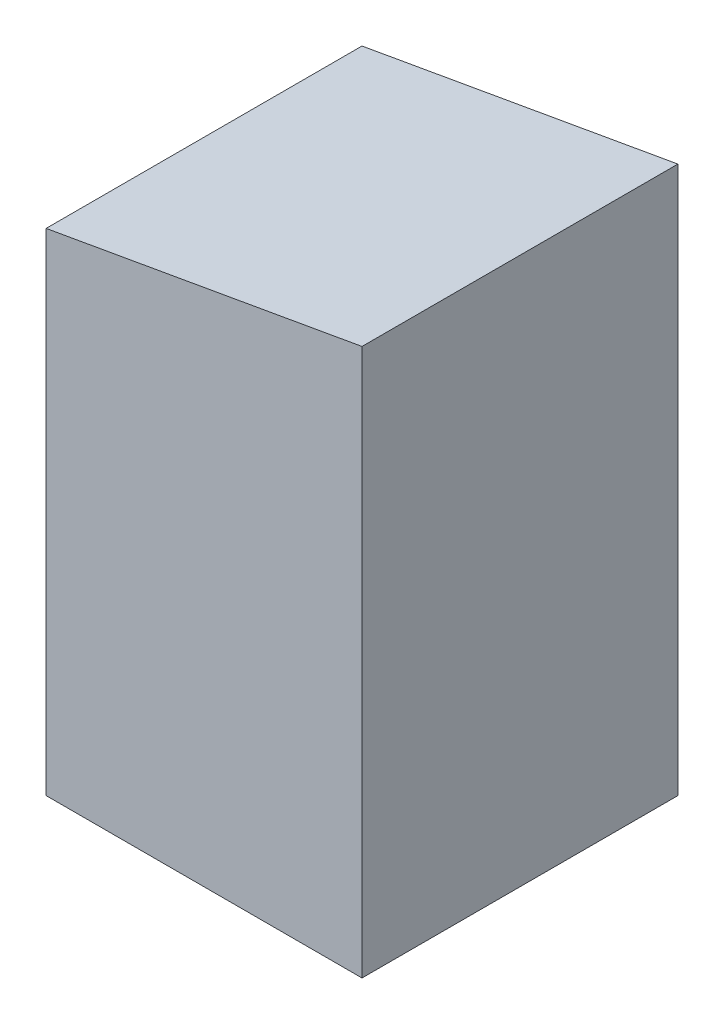
ISO-10303-21;
HEADER;
FILE_DESCRIPTION(('STEP AP214'),'2;1');
FILE_NAME('part.step','',(''),(''),'','','');
FILE_SCHEMA(('AUTOMOTIVE_DESIGN { 1 0 10303 214 1 1 1 1 }'));
ENDSEC;
DATA;
#1=APPLICATION_CONTEXT('core data for automotive mechanical design processes');
#2=APPLICATION_PROTOCOL_DEFINITION('international standard','automotive_design',2000,#1);
#3=PRODUCT_CONTEXT('',#1,'mechanical');
#4=PRODUCT('Part','Part','',(#3));
#5=PRODUCT_RELATED_PRODUCT_CATEGORY('part','',(#4));
#6=PRODUCT_DEFINITION_FORMATION('','',#4);
#7=PRODUCT_DEFINITION_CONTEXT('part definition',#1,'design');
#8=PRODUCT_DEFINITION('design','',#6,#7);
#9=PRODUCT_DEFINITION_SHAPE('','',#8);
#10=(LENGTH_UNIT() NAMED_UNIT(*) SI_UNIT(.MILLI.,.METRE.));
#11=(NAMED_UNIT(*) PLANE_ANGLE_UNIT() SI_UNIT($,.RADIAN.));
#12=(NAMED_UNIT(*) SI_UNIT($,.STERADIAN.) SOLID_ANGLE_UNIT());
#13=UNCERTAINTY_MEASURE_WITH_UNIT(LENGTH_MEASURE(1.E-05),#10,'distance_accuracy_value','');
#14=(GEOMETRIC_REPRESENTATION_CONTEXT(3) GLOBAL_UNCERTAINTY_ASSIGNED_CONTEXT((#13)) GLOBAL_UNIT_ASSIGNED_CONTEXT((#10,
#11,#12)) REPRESENTATION_CONTEXT('',''));
#15=CARTESIAN_POINT('',(0.,0.,0.));
#16=DIRECTION('',(0.,0.,1.));
#17=DIRECTION('',(1.,0.,0.));
#18=AXIS2_PLACEMENT_3D('',#15,#16,#17);
#19=CARTESIAN_POINT('',(0.,0.,50.8));
#20=DIRECTION('',(1.,0.,0.));
#21=DIRECTION('',(0.,0.,-1.));
#22=AXIS2_PLACEMENT_3D('',#19,#20,#21);
#23=PLANE('',#22);
#24=DIRECTION('',(0.,-1.,0.));
#25=VECTOR('',#24,1.);
#26=CARTESIAN_POINT('',(0.,0.,0.));
#27=LINE('',#26,#25);
#28=CARTESIAN_POINT('',(0.,79.,0.));
#29=VERTEX_POINT('',#28);
#30=CARTESIAN_POINT('',(0.,0.,0.));
#31=VERTEX_POINT('',#30);
#32=EDGE_CURVE('E99',#29,#31,#27,.T.);
#33=ORIENTED_EDGE('',*,*,#32,.T.);
#34=DIRECTION('',(0.,0.,-1.));
#35=VECTOR('',#34,1.);
#36=CARTESIAN_POINT('',(0.,0.,50.8));
#37=LINE('',#36,#35);
#38=CARTESIAN_POINT('',(0.,0.,50.8));
#39=VERTEX_POINT('',#38);
#40=EDGE_CURVE('E11',#39,#31,#37,.T.);
#41=ORIENTED_EDGE('',*,*,#40,.F.);
#42=DIRECTION('',(0.,-1.,0.));
#43=VECTOR('',#42,1.);
#44=CARTESIAN_POINT('',(0.,0.,50.8));
#45=LINE('',#44,#43);
#46=CARTESIAN_POINT('',(0.,79.,50.8));
#47=VERTEX_POINT('',#46);
#48=EDGE_CURVE('E87',#47,#39,#45,.T.);
#49=ORIENTED_EDGE('',*,*,#48,.F.);
#50=DIRECTION('',(0.,0.,-1.));
#51=VECTOR('',#50,1.);
#52=CARTESIAN_POINT('',(0.,79.,50.8));
#53=LINE('',#52,#51);
#54=EDGE_CURVE('E95',#47,#29,#53,.T.);
#55=ORIENTED_EDGE('',*,*,#54,.T.);
#56=EDGE_LOOP('',(#33,#41,#49,#55));
#57=FACE_BOUND('',#56,.T.);
#58=ADVANCED_FACE('F36',(#57),#23,.F.);
#59=CARTESIAN_POINT('',(0.,0.,50.8));
#60=DIRECTION('',(0.,1.,0.));
#61=DIRECTION('',(0.,0.,1.));
#62=AXIS2_PLACEMENT_3D('',#59,#60,#61);
#63=PLANE('',#62);
#64=DIRECTION('',(1.,0.,0.));
#65=VECTOR('',#64,1.);
#66=CARTESIAN_POINT('',(0.,0.,0.));
#67=LINE('',#66,#65);
#68=CARTESIAN_POINT('',(50.8,0.,0.));
#69=VERTEX_POINT('',#68);
#70=EDGE_CURVE('E91',#31,#69,#67,.T.);
#71=ORIENTED_EDGE('',*,*,#70,.T.);
#72=DIRECTION('',(0.,0.,-1.));
#73=VECTOR('',#72,1.);
#74=CARTESIAN_POINT('',(50.8,0.,50.8));
#75=LINE('',#74,#73);
#76=CARTESIAN_POINT('',(50.8,0.,50.8));
#77=VERTEX_POINT('',#76);
#78=EDGE_CURVE('E44',#77,#69,#75,.T.);
#79=ORIENTED_EDGE('',*,*,#78,.F.);
#80=DIRECTION('',(1.,0.,0.));
#81=VECTOR('',#80,1.);
#82=CARTESIAN_POINT('',(0.,0.,50.8));
#83=LINE('',#82,#81);
#84=EDGE_CURVE('E82',#39,#77,#83,.T.);
#85=ORIENTED_EDGE('',*,*,#84,.F.);
#86=ORIENTED_EDGE('',*,*,#40,.T.);
#87=EDGE_LOOP('',(#71,#79,#85,#86));
#88=FACE_BOUND('',#87,.T.);
#89=ADVANCED_FACE('F90',(#88),#63,.F.);
#90=CARTESIAN_POINT('',(50.8,0.,50.8));
#91=DIRECTION('',(-1.,0.,0.));
#92=DIRECTION('',(0.,0.,1.));
#93=AXIS2_PLACEMENT_3D('',#90,#91,#92);
#94=PLANE('',#93);
#95=DIRECTION('',(0.,1.,0.));
#96=VECTOR('',#95,1.);
#97=CARTESIAN_POINT('',(50.8,0.,0.));
#98=LINE('',#97,#96);
#99=CARTESIAN_POINT('',(50.8,87.9574106199903,0.));
#100=VERTEX_POINT('',#99);
#101=EDGE_CURVE('E69',#69,#100,#98,.T.);
#102=ORIENTED_EDGE('',*,*,#101,.T.);
#103=DIRECTION('',(0.,0.,-1.));
#104=VECTOR('',#103,1.);
#105=CARTESIAN_POINT('',(50.8,87.9574106199903,50.8));
#106=LINE('',#105,#104);
#107=CARTESIAN_POINT('',(50.8,87.9574106199903,50.8));
#108=VERTEX_POINT('',#107);
#109=EDGE_CURVE('E92',#108,#100,#106,.T.);
#110=ORIENTED_EDGE('',*,*,#109,.F.);
#111=DIRECTION('',(0.,1.,0.));
#112=VECTOR('',#111,1.);
#113=CARTESIAN_POINT('',(50.8,0.,50.8));
#114=LINE('',#113,#112);
#115=EDGE_CURVE('E85',#77,#108,#114,.T.);
#116=ORIENTED_EDGE('',*,*,#115,.F.);
#117=ORIENTED_EDGE('',*,*,#78,.T.);
#118=EDGE_LOOP('',(#102,#110,#116,#117));
#119=FACE_BOUND('',#118,.T.);
#120=ADVANCED_FACE('F93',(#119),#94,.F.);
#121=CARTESIAN_POINT('',(50.8,87.9574106199903,50.8));
#122=DIRECTION('',(0.173648177666935,-0.984807753012207,0.));
#123=DIRECTION('',(0.984807753012207,0.173648177666935,0.));
#124=AXIS2_PLACEMENT_3D('',#121,#122,#123);
#125=PLANE('',#124);
#126=DIRECTION('',(-0.984807753012207,-0.173648177666935,0.));
#127=VECTOR('',#126,1.);
#128=CARTESIAN_POINT('',(50.8,87.9574106199903,0.));
#129=LINE('',#128,#127);
#130=EDGE_CURVE('E75',#100,#29,#129,.T.);
#131=ORIENTED_EDGE('',*,*,#130,.T.);
#132=ORIENTED_EDGE('',*,*,#54,.F.);
#133=DIRECTION('',(-0.984807753012207,-0.173648177666935,0.));
#134=VECTOR('',#133,1.);
#135=CARTESIAN_POINT('',(50.8,87.9574106199903,50.8));
#136=LINE('',#135,#134);
#137=EDGE_CURVE('E52',#108,#47,#136,.T.);
#138=ORIENTED_EDGE('',*,*,#137,.F.);
#139=ORIENTED_EDGE('',*,*,#109,.T.);
#140=EDGE_LOOP('',(#131,#132,#138,#139));
#141=FACE_BOUND('',#140,.T.);
#142=ADVANCED_FACE('F106',(#141),#125,.F.);
#143=CARTESIAN_POINT('',(0.,0.,50.8));
#144=DIRECTION('',(0.,0.,-1.));
#145=DIRECTION('',(-1.,0.,0.));
#146=AXIS2_PLACEMENT_3D('',#143,#144,#145);
#147=PLANE('',#146);
#148=ORIENTED_EDGE('',*,*,#48,.T.);
#149=ORIENTED_EDGE('',*,*,#84,.T.);
#150=ORIENTED_EDGE('',*,*,#115,.T.);
#151=ORIENTED_EDGE('',*,*,#137,.T.);
#152=EDGE_LOOP('',(#148,#149,#150,#151));
#153=FACE_BOUND('',#152,.T.);
#154=ADVANCED_FACE('F83',(#153),#147,.F.);
#155=CARTESIAN_POINT('',(0.,0.,0.));
#156=DIRECTION('',(0.,0.,-1.));
#157=DIRECTION('',(-1.,0.,0.));
#158=AXIS2_PLACEMENT_3D('',#155,#156,#157);
#159=PLANE('',#158);
#160=ORIENTED_EDGE('',*,*,#32,.F.);
#161=ORIENTED_EDGE('',*,*,#130,.F.);
#162=ORIENTED_EDGE('',*,*,#101,.F.);
#163=ORIENTED_EDGE('',*,*,#70,.F.);
#164=EDGE_LOOP('',(#160,#161,#162,#163));
#165=FACE_BOUND('',#164,.T.);
#166=ADVANCED_FACE('F109',(#165),#159,.T.);
#167=CLOSED_SHELL('',(#58,#89,#120,#142,#154,#166));
#168=MANIFOLD_SOLID_BREP('B2',#167);
#169=ADVANCED_BREP_SHAPE_REPRESENTATION('',(#18,#168),#14);
#170=SHAPE_DEFINITION_REPRESENTATION(#9,#169);
ENDSEC;
END-ISO-10303-21;
